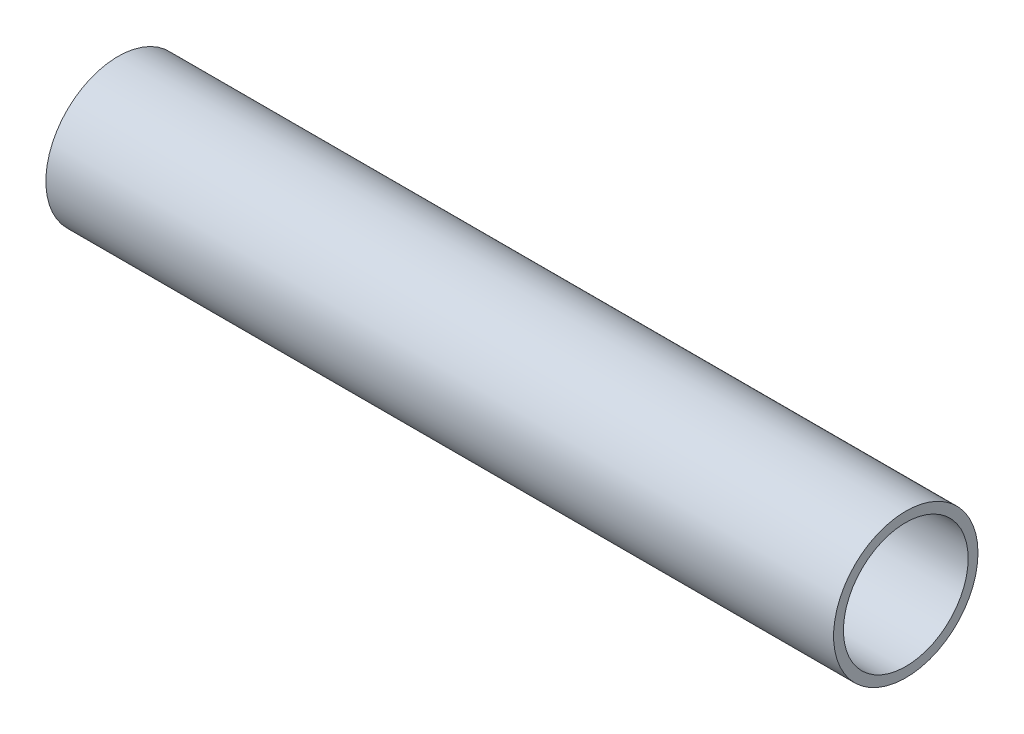
ISO-10303-21;
HEADER;
FILE_DESCRIPTION(('STEP AP214'),'2;1');
FILE_NAME('part.step','',(''),(''),'','','');
FILE_SCHEMA(('AUTOMOTIVE_DESIGN { 1 0 10303 214 1 1 1 1 }'));
ENDSEC;
DATA;
#1=APPLICATION_CONTEXT('core data for automotive mechanical design processes');
#2=APPLICATION_PROTOCOL_DEFINITION('international standard','automotive_design',2000,#1);
#3=PRODUCT_CONTEXT('',#1,'mechanical');
#4=PRODUCT('Part','Part','',(#3));
#5=PRODUCT_RELATED_PRODUCT_CATEGORY('part','',(#4));
#6=PRODUCT_DEFINITION_FORMATION('','',#4);
#7=PRODUCT_DEFINITION_CONTEXT('part definition',#1,'design');
#8=PRODUCT_DEFINITION('design','',#6,#7);
#9=PRODUCT_DEFINITION_SHAPE('','',#8);
#10=(LENGTH_UNIT() NAMED_UNIT(*) SI_UNIT(.MILLI.,.METRE.));
#11=(NAMED_UNIT(*) PLANE_ANGLE_UNIT() SI_UNIT($,.RADIAN.));
#12=(NAMED_UNIT(*) SI_UNIT($,.STERADIAN.) SOLID_ANGLE_UNIT());
#13=UNCERTAINTY_MEASURE_WITH_UNIT(LENGTH_MEASURE(1.E-05),#10,'distance_accuracy_value','');
#14=(GEOMETRIC_REPRESENTATION_CONTEXT(3) GLOBAL_UNCERTAINTY_ASSIGNED_CONTEXT((#13)) GLOBAL_UNIT_ASSIGNED_CONTEXT((#10,
#11,#12)) REPRESENTATION_CONTEXT('',''));
#15=CARTESIAN_POINT('',(0.,0.,0.));
#16=DIRECTION('',(0.,0.,1.));
#17=DIRECTION('',(1.,0.,0.));
#18=AXIS2_PLACEMENT_3D('',#15,#16,#17);
#19=CARTESIAN_POINT('',(120.,0.,0.));
#20=DIRECTION('',(1.,0.,0.));
#21=DIRECTION('',(0.,0.,-1.));
#22=AXIS2_PLACEMENT_3D('',#19,#20,#21);
#23=PLANE('',#22);
#24=CARTESIAN_POINT('',(120.,0.,0.));
#25=DIRECTION('',(1.,0.,0.));
#26=DIRECTION('',(0.,0.,-1.));
#27=AXIS2_PLACEMENT_3D('',#24,#25,#26);
#28=CIRCLE('',#27,11.);
#29=CARTESIAN_POINT('',(120.,0.,-11.));
#30=VERTEX_POINT('',#29);
#31=EDGE_CURVE('E12',#30,#30,#28,.T.);
#32=ORIENTED_EDGE('',*,*,#31,.T.);
#33=EDGE_LOOP('',(#32));
#34=FACE_BOUND('',#33,.T.);
#35=CARTESIAN_POINT('',(120.,0.,0.));
#36=DIRECTION('',(1.,0.,0.));
#37=DIRECTION('',(0.,0.,-1.));
#38=AXIS2_PLACEMENT_3D('',#35,#36,#37);
#39=CIRCLE('',#38,9.5);
#40=CARTESIAN_POINT('',(120.,0.,-9.5));
#41=VERTEX_POINT('',#40);
#42=EDGE_CURVE('E51',#41,#41,#39,.T.);
#43=ORIENTED_EDGE('',*,*,#42,.F.);
#44=EDGE_LOOP('',(#43));
#45=FACE_BOUND('',#44,.T.);
#46=ADVANCED_FACE('F40',(#34,#45),#23,.T.);
#47=CARTESIAN_POINT('',(0.,0.,0.));
#48=DIRECTION('',(1.,0.,0.));
#49=DIRECTION('',(0.,0.,-1.));
#50=AXIS2_PLACEMENT_3D('',#47,#48,#49);
#51=PLANE('',#50);
#52=CARTESIAN_POINT('',(0.,0.,0.));
#53=DIRECTION('',(1.,0.,0.));
#54=DIRECTION('',(0.,0.,-1.));
#55=AXIS2_PLACEMENT_3D('',#52,#53,#54);
#56=CIRCLE('',#55,11.);
#57=CARTESIAN_POINT('',(0.,0.,-11.));
#58=VERTEX_POINT('',#57);
#59=EDGE_CURVE('E44',#58,#58,#56,.T.);
#60=ORIENTED_EDGE('',*,*,#59,.F.);
#61=EDGE_LOOP('',(#60));
#62=FACE_BOUND('',#61,.T.);
#63=CARTESIAN_POINT('',(0.,0.,0.));
#64=DIRECTION('',(1.,0.,0.));
#65=DIRECTION('',(0.,0.,-1.));
#66=AXIS2_PLACEMENT_3D('',#63,#64,#65);
#67=CIRCLE('',#66,9.5);
#68=CARTESIAN_POINT('',(0.,0.,-9.5));
#69=VERTEX_POINT('',#68);
#70=EDGE_CURVE('E53',#69,#69,#67,.T.);
#71=ORIENTED_EDGE('',*,*,#70,.T.);
#72=EDGE_LOOP('',(#71));
#73=FACE_BOUND('',#72,.T.);
#74=ADVANCED_FACE('F63',(#62,#73),#51,.F.);
#75=CARTESIAN_POINT('',(120.,0.,0.));
#76=DIRECTION('',(-1.,0.,0.));
#77=DIRECTION('',(0.,0.,1.));
#78=AXIS2_PLACEMENT_3D('',#75,#76,#77);
#79=CYLINDRICAL_SURFACE('',#78,11.);
#80=ORIENTED_EDGE('',*,*,#31,.F.);
#81=EDGE_LOOP('',(#80));
#82=FACE_BOUND('',#81,.T.);
#83=ORIENTED_EDGE('',*,*,#59,.T.);
#84=EDGE_LOOP('',(#83));
#85=FACE_BOUND('',#84,.T.);
#86=ADVANCED_FACE('F42',(#82,#85),#79,.T.);
#87=CARTESIAN_POINT('',(120.,0.,0.));
#88=DIRECTION('',(-1.,0.,0.));
#89=DIRECTION('',(0.,0.,1.));
#90=AXIS2_PLACEMENT_3D('',#87,#88,#89);
#91=CYLINDRICAL_SURFACE('',#90,9.5);
#92=ORIENTED_EDGE('',*,*,#42,.T.);
#93=EDGE_LOOP('',(#92));
#94=FACE_BOUND('',#93,.T.);
#95=ORIENTED_EDGE('',*,*,#70,.F.);
#96=EDGE_LOOP('',(#95));
#97=FACE_BOUND('',#96,.T.);
#98=ADVANCED_FACE('F59',(#94,#97),#91,.F.);
#99=CLOSED_SHELL('',(#46,#74,#86,#98));
#100=MANIFOLD_SOLID_BREP('B2',#99);
#101=ADVANCED_BREP_SHAPE_REPRESENTATION('',(#18,#100),#14);
#102=SHAPE_DEFINITION_REPRESENTATION(#9,#101);
ENDSEC;
END-ISO-10303-21;
